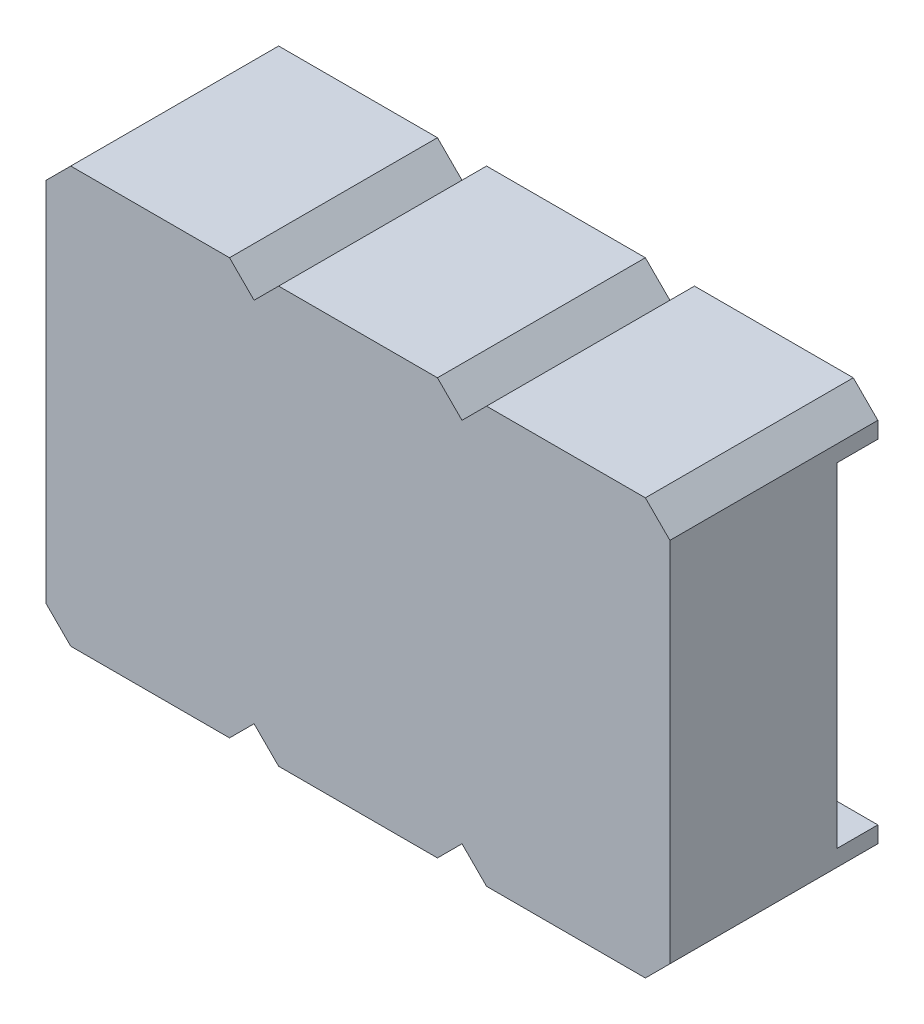
ISO-10303-21;
HEADER;
FILE_DESCRIPTION(('STEP AP214'),'2;1');
FILE_NAME('part.step','',(''),(''),'','','');
FILE_SCHEMA(('AUTOMOTIVE_DESIGN { 1 0 10303 214 1 1 1 1 }'));
ENDSEC;
DATA;
#1=APPLICATION_CONTEXT('core data for automotive mechanical design processes');
#2=APPLICATION_PROTOCOL_DEFINITION('international standard','automotive_design',2000,#1);
#3=PRODUCT_CONTEXT('',#1,'mechanical');
#4=PRODUCT('Part','Part','',(#3));
#5=PRODUCT_RELATED_PRODUCT_CATEGORY('part','',(#4));
#6=PRODUCT_DEFINITION_FORMATION('','',#4);
#7=PRODUCT_DEFINITION_CONTEXT('part definition',#1,'design');
#8=PRODUCT_DEFINITION('design','',#6,#7);
#9=PRODUCT_DEFINITION_SHAPE('','',#8);
#10=(LENGTH_UNIT() NAMED_UNIT(*) SI_UNIT(.MILLI.,.METRE.));
#11=(NAMED_UNIT(*) PLANE_ANGLE_UNIT() SI_UNIT($,.RADIAN.));
#12=(NAMED_UNIT(*) SI_UNIT($,.STERADIAN.) SOLID_ANGLE_UNIT());
#13=UNCERTAINTY_MEASURE_WITH_UNIT(LENGTH_MEASURE(1.E-05),#10,'distance_accuracy_value','');
#14=(GEOMETRIC_REPRESENTATION_CONTEXT(3) GLOBAL_UNCERTAINTY_ASSIGNED_CONTEXT((#13)) GLOBAL_UNIT_ASSIGNED_CONTEXT((#10,
#11,#12)) REPRESENTATION_CONTEXT('',''));
#15=CARTESIAN_POINT('',(0.,0.,0.));
#16=DIRECTION('',(0.,0.,1.));
#17=DIRECTION('',(1.,0.,0.));
#18=AXIS2_PLACEMENT_3D('',#15,#16,#17);
#19=CARTESIAN_POINT('',(0.,-2.04,0.));
#20=DIRECTION('',(0.,1.,0.));
#21=DIRECTION('',(0.,0.,1.));
#22=AXIS2_PLACEMENT_3D('',#19,#20,#21);
#23=PLANE('',#22);
#24=DIRECTION('',(-1.,0.,0.));
#25=VECTOR('',#24,1.);
#26=CARTESIAN_POINT('',(0.,-2.04,0.));
#27=LINE('',#26,#25);
#28=CARTESIAN_POINT('',(-3.81,-2.04,0.));
#29=VERTEX_POINT('',#28);
#30=CARTESIAN_POINT('',(3.81,-2.04,0.));
#31=VERTEX_POINT('',#30);
#32=EDGE_CURVE('E219',#29,#31,#27,.F.);
#33=ORIENTED_EDGE('',*,*,#32,.F.);
#34=DIRECTION('',(0.,0.,1.));
#35=VECTOR('',#34,1.);
#36=CARTESIAN_POINT('',(-3.81,-2.04,0.));
#37=LINE('',#36,#35);
#38=CARTESIAN_POINT('',(-3.81,-2.04,0.5));
#39=VERTEX_POINT('',#38);
#40=EDGE_CURVE('E212',#29,#39,#37,.T.);
#41=ORIENTED_EDGE('',*,*,#40,.T.);
#42=DIRECTION('',(-1.,0.,0.));
#43=VECTOR('',#42,1.);
#44=CARTESIAN_POINT('',(0.,-2.04,0.5));
#45=LINE('',#44,#43);
#46=CARTESIAN_POINT('',(3.81,-2.04,0.5));
#47=VERTEX_POINT('',#46);
#48=EDGE_CURVE('E221',#47,#39,#45,.T.);
#49=ORIENTED_EDGE('',*,*,#48,.F.);
#50=DIRECTION('',(0.,0.,1.));
#51=VECTOR('',#50,1.);
#52=CARTESIAN_POINT('',(3.81,-2.04,0.));
#53=LINE('',#52,#51);
#54=EDGE_CURVE('E20',#47,#31,#53,.F.);
#55=ORIENTED_EDGE('',*,*,#54,.T.);
#56=EDGE_LOOP('',(#33,#41,#49,#55));
#57=FACE_BOUND('',#56,.T.);
#58=ADVANCED_FACE('F17',(#57),#23,.T.);
#59=CARTESIAN_POINT('',(0.,2.04,2.54));
#60=DIRECTION('',(0.,-1.,0.));
#61=DIRECTION('',(0.,0.,-1.));
#62=AXIS2_PLACEMENT_3D('',#59,#60,#61);
#63=PLANE('',#62);
#64=DIRECTION('',(-1.,0.,0.));
#65=VECTOR('',#64,1.);
#66=CARTESIAN_POINT('',(0.,2.04,0.));
#67=LINE('',#66,#65);
#68=CARTESIAN_POINT('',(3.81,2.04,0.));
#69=VERTEX_POINT('',#68);
#70=CARTESIAN_POINT('',(-3.81,2.04,0.));
#71=VERTEX_POINT('',#70);
#72=EDGE_CURVE('E368',#69,#71,#67,.T.);
#73=ORIENTED_EDGE('',*,*,#72,.F.);
#74=DIRECTION('',(0.,0.,-1.));
#75=VECTOR('',#74,1.);
#76=CARTESIAN_POINT('',(3.81,2.04,2.54));
#77=LINE('',#76,#75);
#78=CARTESIAN_POINT('',(3.81,2.04,0.5));
#79=VERTEX_POINT('',#78);
#80=EDGE_CURVE('E209',#69,#79,#77,.F.);
#81=ORIENTED_EDGE('',*,*,#80,.T.);
#82=DIRECTION('',(-1.,0.,0.));
#83=VECTOR('',#82,1.);
#84=CARTESIAN_POINT('',(0.,2.04,0.5));
#85=LINE('',#84,#83);
#86=CARTESIAN_POINT('',(-3.81,2.04,0.5));
#87=VERTEX_POINT('',#86);
#88=EDGE_CURVE('E378',#87,#79,#85,.F.);
#89=ORIENTED_EDGE('',*,*,#88,.F.);
#90=DIRECTION('',(0.,0.,-1.));
#91=VECTOR('',#90,1.);
#92=CARTESIAN_POINT('',(-3.81,2.04,2.54));
#93=LINE('',#92,#91);
#94=EDGE_CURVE('E211',#87,#71,#93,.T.);
#95=ORIENTED_EDGE('',*,*,#94,.T.);
#96=EDGE_LOOP('',(#73,#81,#89,#95));
#97=FACE_BOUND('',#96,.T.);
#98=ADVANCED_FACE('F639',(#97),#63,.T.);
#99=CARTESIAN_POINT('',(1.12,2.39,0.76));
#100=DIRECTION('',(0.707106781186548,0.707106781186548,0.));
#101=DIRECTION('',(-0.707106781186548,0.707106781186548,0.));
#102=AXIS2_PLACEMENT_3D('',#99,#100,#101);
#103=PLANE('',#102);
#104=DIRECTION('',(0.707106781186548,-0.707106781186547,0.));
#105=VECTOR('',#104,1.);
#106=CARTESIAN_POINT('',(0.97,2.54,0.));
#107=LINE('',#106,#105);
#108=CARTESIAN_POINT('',(0.97,2.54,0.));
#109=VERTEX_POINT('',#108);
#110=CARTESIAN_POINT('',(1.27,2.24,0.));
#111=VERTEX_POINT('',#110);
#112=EDGE_CURVE('E374',#109,#111,#107,.T.);
#113=ORIENTED_EDGE('',*,*,#112,.F.);
#114=DIRECTION('',(0.,0.,1.));
#115=VECTOR('',#114,1.);
#116=CARTESIAN_POINT('',(0.97,2.54,0.));
#117=LINE('',#116,#115);
#118=CARTESIAN_POINT('',(0.97,2.54,2.54));
#119=VERTEX_POINT('',#118);
#120=EDGE_CURVE('E354',#119,#109,#117,.F.);
#121=ORIENTED_EDGE('',*,*,#120,.F.);
#122=DIRECTION('',(-0.707106781186548,0.707106781186548,0.));
#123=VECTOR('',#122,1.);
#124=CARTESIAN_POINT('',(1.12,2.39,2.54));
#125=LINE('',#124,#123);
#126=CARTESIAN_POINT('',(1.27,2.24,2.54));
#127=VERTEX_POINT('',#126);
#128=EDGE_CURVE('E191',#119,#127,#125,.F.);
#129=ORIENTED_EDGE('',*,*,#128,.T.);
#130=DIRECTION('',(0.,0.,1.));
#131=VECTOR('',#130,1.);
#132=CARTESIAN_POINT('',(1.27,2.24,0.76));
#133=LINE('',#132,#131);
#134=EDGE_CURVE('E358',#111,#127,#133,.T.);
#135=ORIENTED_EDGE('',*,*,#134,.F.);
#136=EDGE_LOOP('',(#113,#121,#129,#135));
#137=FACE_BOUND('',#136,.T.);
#138=ADVANCED_FACE('F420',(#137),#103,.T.);
#139=CARTESIAN_POINT('',(-1.12,2.39,0.76));
#140=DIRECTION('',(-0.707106781186548,0.707106781186548,0.));
#141=DIRECTION('',(-0.707106781186548,-0.707106781186548,0.));
#142=AXIS2_PLACEMENT_3D('',#139,#140,#141);
#143=PLANE('',#142);
#144=DIRECTION('',(-0.707106781186548,-0.707106781186548,0.));
#145=VECTOR('',#144,1.);
#146=CARTESIAN_POINT('',(-1.12,2.39,2.54));
#147=LINE('',#146,#145);
#148=CARTESIAN_POINT('',(-1.27,2.24,2.54));
#149=VERTEX_POINT('',#148);
#150=CARTESIAN_POINT('',(-0.97,2.54,2.54));
#151=VERTEX_POINT('',#150);
#152=EDGE_CURVE('E179',#149,#151,#147,.F.);
#153=ORIENTED_EDGE('',*,*,#152,.T.);
#154=DIRECTION('',(0.,0.,1.));
#155=VECTOR('',#154,1.);
#156=CARTESIAN_POINT('',(-0.97,2.54,0.));
#157=LINE('',#156,#155);
#158=CARTESIAN_POINT('',(-0.97,2.54,0.));
#159=VERTEX_POINT('',#158);
#160=EDGE_CURVE('E349',#159,#151,#157,.T.);
#161=ORIENTED_EDGE('',*,*,#160,.F.);
#162=DIRECTION('',(0.707106781186548,0.707106781186547,0.));
#163=VECTOR('',#162,1.);
#164=CARTESIAN_POINT('',(-1.27,2.24,0.));
#165=LINE('',#164,#163);
#166=CARTESIAN_POINT('',(-1.27,2.24,0.));
#167=VERTEX_POINT('',#166);
#168=EDGE_CURVE('E196',#167,#159,#165,.T.);
#169=ORIENTED_EDGE('',*,*,#168,.F.);
#170=DIRECTION('',(0.,0.,1.));
#171=VECTOR('',#170,1.);
#172=CARTESIAN_POINT('',(-1.27,2.24,0.76));
#173=LINE('',#172,#171);
#174=EDGE_CURVE('E194',#149,#167,#173,.F.);
#175=ORIENTED_EDGE('',*,*,#174,.F.);
#176=EDGE_LOOP('',(#153,#161,#169,#175));
#177=FACE_BOUND('',#176,.T.);
#178=ADVANCED_FACE('F195',(#177),#143,.T.);
#179=CARTESIAN_POINT('',(-1.42,2.39,0.76));
#180=DIRECTION('',(0.707106781186548,0.707106781186548,0.));
#181=DIRECTION('',(-0.707106781186548,0.707106781186548,0.));
#182=AXIS2_PLACEMENT_3D('',#179,#180,#181);
#183=PLANE('',#182);
#184=DIRECTION('',(0.707106781186547,-0.707106781186547,0.));
#185=VECTOR('',#184,1.);
#186=CARTESIAN_POINT('',(-1.57,2.54,0.));
#187=LINE('',#186,#185);
#188=CARTESIAN_POINT('',(-1.57,2.54,0.));
#189=VERTEX_POINT('',#188);
#190=EDGE_CURVE('E364',#189,#167,#187,.T.);
#191=ORIENTED_EDGE('',*,*,#190,.F.);
#192=DIRECTION('',(0.,0.,1.));
#193=VECTOR('',#192,1.);
#194=CARTESIAN_POINT('',(-1.57,2.54,0.));
#195=LINE('',#194,#193);
#196=CARTESIAN_POINT('',(-1.57,2.54,2.54));
#197=VERTEX_POINT('',#196);
#198=EDGE_CURVE('E203',#197,#189,#195,.F.);
#199=ORIENTED_EDGE('',*,*,#198,.F.);
#200=DIRECTION('',(-0.707106781186548,0.707106781186548,0.));
#201=VECTOR('',#200,1.);
#202=CARTESIAN_POINT('',(-1.42,2.39,2.54));
#203=LINE('',#202,#201);
#204=EDGE_CURVE('E184',#197,#149,#203,.F.);
#205=ORIENTED_EDGE('',*,*,#204,.T.);
#206=ORIENTED_EDGE('',*,*,#174,.T.);
#207=EDGE_LOOP('',(#191,#199,#205,#206));
#208=FACE_BOUND('',#207,.T.);
#209=ADVANCED_FACE('F201',(#208),#183,.T.);
#210=CARTESIAN_POINT('',(-3.66,2.39,0.76));
#211=DIRECTION('',(-0.707106781186548,0.707106781186548,0.));
#212=DIRECTION('',(-0.707106781186548,-0.707106781186548,0.));
#213=AXIS2_PLACEMENT_3D('',#210,#211,#212);
#214=PLANE('',#213);
#215=DIRECTION('',(-0.707106781186548,-0.707106781186548,0.));
#216=VECTOR('',#215,1.);
#217=CARTESIAN_POINT('',(-3.66,2.39,2.54));
#218=LINE('',#217,#216);
#219=CARTESIAN_POINT('',(-3.81,2.24,2.54));
#220=VERTEX_POINT('',#219);
#221=CARTESIAN_POINT('',(-3.51,2.54,2.54));
#222=VERTEX_POINT('',#221);
#223=EDGE_CURVE('E199',#220,#222,#218,.F.);
#224=ORIENTED_EDGE('',*,*,#223,.T.);
#225=DIRECTION('',(0.,0.,1.));
#226=VECTOR('',#225,1.);
#227=CARTESIAN_POINT('',(-3.51,2.54,0.));
#228=LINE('',#227,#226);
#229=CARTESIAN_POINT('',(-3.51,2.54,0.));
#230=VERTEX_POINT('',#229);
#231=EDGE_CURVE('E273',#230,#222,#228,.T.);
#232=ORIENTED_EDGE('',*,*,#231,.F.);
#233=DIRECTION('',(0.707106781186548,0.707106781186547,0.));
#234=VECTOR('',#233,1.);
#235=CARTESIAN_POINT('',(-3.81,2.24,0.));
#236=LINE('',#235,#234);
#237=CARTESIAN_POINT('',(-3.81,2.24,0.));
#238=VERTEX_POINT('',#237);
#239=EDGE_CURVE('E366',#238,#230,#236,.T.);
#240=ORIENTED_EDGE('',*,*,#239,.F.);
#241=DIRECTION('',(0.,0.,1.));
#242=VECTOR('',#241,1.);
#243=CARTESIAN_POINT('',(-3.81,2.24,1.52));
#244=LINE('',#243,#242);
#245=EDGE_CURVE('E276',#220,#238,#244,.F.);
#246=ORIENTED_EDGE('',*,*,#245,.F.);
#247=EDGE_LOOP('',(#224,#232,#240,#246));
#248=FACE_BOUND('',#247,.T.);
#249=ADVANCED_FACE('F272',(#248),#214,.T.);
#250=CARTESIAN_POINT('',(-1.42,-2.39,2.03));
#251=DIRECTION('',(0.707106781186548,-0.707106781186548,0.));
#252=DIRECTION('',(0.707106781186548,0.707106781186548,0.));
#253=AXIS2_PLACEMENT_3D('',#250,#251,#252);
#254=PLANE('',#253);
#255=DIRECTION('',(0.707106781186548,0.707106781186548,0.));
#256=VECTOR('',#255,1.);
#257=CARTESIAN_POINT('',(-1.42,-2.39,2.54));
#258=LINE('',#257,#256);
#259=CARTESIAN_POINT('',(-1.27,-2.24,2.54));
#260=VERTEX_POINT('',#259);
#261=CARTESIAN_POINT('',(-1.57,-2.54,2.54));
#262=VERTEX_POINT('',#261);
#263=EDGE_CURVE('E175',#260,#262,#258,.F.);
#264=ORIENTED_EDGE('',*,*,#263,.T.);
#265=DIRECTION('',(0.,0.,-1.));
#266=VECTOR('',#265,1.);
#267=CARTESIAN_POINT('',(-1.57,-2.54,2.54));
#268=LINE('',#267,#266);
#269=CARTESIAN_POINT('',(-1.57,-2.54,0.));
#270=VERTEX_POINT('',#269);
#271=EDGE_CURVE('E333',#270,#262,#268,.F.);
#272=ORIENTED_EDGE('',*,*,#271,.F.);
#273=DIRECTION('',(-0.707106781186547,-0.707106781186547,0.));
#274=VECTOR('',#273,1.);
#275=CARTESIAN_POINT('',(-1.27,-2.24,0.));
#276=LINE('',#275,#274);
#277=CARTESIAN_POINT('',(-1.27,-2.24,0.));
#278=VERTEX_POINT('',#277);
#279=EDGE_CURVE('E241',#278,#270,#276,.T.);
#280=ORIENTED_EDGE('',*,*,#279,.F.);
#281=DIRECTION('',(0.,0.,1.));
#282=VECTOR('',#281,1.);
#283=CARTESIAN_POINT('',(-1.27,-2.24,2.03));
#284=LINE('',#283,#282);
#285=EDGE_CURVE('E259',#260,#278,#284,.F.);
#286=ORIENTED_EDGE('',*,*,#285,.F.);
#287=EDGE_LOOP('',(#264,#272,#280,#286));
#288=FACE_BOUND('',#287,.T.);
#289=ADVANCED_FACE('F438',(#288),#254,.T.);
#290=CARTESIAN_POINT('',(-3.66,-2.39,2.03));
#291=DIRECTION('',(-0.707106781186548,-0.707106781186548,0.));
#292=DIRECTION('',(0.707106781186548,-0.707106781186548,0.));
#293=AXIS2_PLACEMENT_3D('',#290,#291,#292);
#294=PLANE('',#293);
#295=DIRECTION('',(-0.707106781186548,0.707106781186547,0.));
#296=VECTOR('',#295,1.);
#297=CARTESIAN_POINT('',(-3.51,-2.54,0.));
#298=LINE('',#297,#296);
#299=CARTESIAN_POINT('',(-3.51,-2.54,0.));
#300=VERTEX_POINT('',#299);
#301=CARTESIAN_POINT('',(-3.81,-2.24,0.));
#302=VERTEX_POINT('',#301);
#303=EDGE_CURVE('E239',#300,#302,#298,.T.);
#304=ORIENTED_EDGE('',*,*,#303,.F.);
#305=DIRECTION('',(0.,0.,-1.));
#306=VECTOR('',#305,1.);
#307=CARTESIAN_POINT('',(-3.51,-2.54,2.54));
#308=LINE('',#307,#306);
#309=CARTESIAN_POINT('',(-3.51,-2.54,2.54));
#310=VERTEX_POINT('',#309);
#311=EDGE_CURVE('E330',#310,#300,#308,.T.);
#312=ORIENTED_EDGE('',*,*,#311,.F.);
#313=DIRECTION('',(0.707106781186548,-0.707106781186548,0.));
#314=VECTOR('',#313,1.);
#315=CARTESIAN_POINT('',(-3.66,-2.39,2.54));
#316=LINE('',#315,#314);
#317=CARTESIAN_POINT('',(-3.81,-2.24,2.54));
#318=VERTEX_POINT('',#317);
#319=EDGE_CURVE('E266',#310,#318,#316,.F.);
#320=ORIENTED_EDGE('',*,*,#319,.T.);
#321=DIRECTION('',(0.,0.,1.));
#322=VECTOR('',#321,1.);
#323=CARTESIAN_POINT('',(-3.81,-2.24,1.52));
#324=LINE('',#323,#322);
#325=EDGE_CURVE('E336',#302,#318,#324,.T.);
#326=ORIENTED_EDGE('',*,*,#325,.F.);
#327=EDGE_LOOP('',(#304,#312,#320,#326));
#328=FACE_BOUND('',#327,.T.);
#329=ADVANCED_FACE('F432',(#328),#294,.T.);
#330=CARTESIAN_POINT('',(1.12,-2.39,2.03));
#331=DIRECTION('',(0.707106781186548,-0.707106781186548,0.));
#332=DIRECTION('',(0.707106781186548,0.707106781186548,0.));
#333=AXIS2_PLACEMENT_3D('',#330,#331,#332);
#334=PLANE('',#333);
#335=DIRECTION('',(0.707106781186548,0.707106781186548,0.));
#336=VECTOR('',#335,1.);
#337=CARTESIAN_POINT('',(1.12,-2.39,2.54));
#338=LINE('',#337,#336);
#339=CARTESIAN_POINT('',(1.27,-2.24,2.54));
#340=VERTEX_POINT('',#339);
#341=CARTESIAN_POINT('',(0.97,-2.54,2.54));
#342=VERTEX_POINT('',#341);
#343=EDGE_CURVE('E264',#340,#342,#338,.F.);
#344=ORIENTED_EDGE('',*,*,#343,.T.);
#345=DIRECTION('',(0.,0.,-1.));
#346=VECTOR('',#345,1.);
#347=CARTESIAN_POINT('',(0.97,-2.54,2.54));
#348=LINE('',#347,#346);
#349=CARTESIAN_POINT('',(0.97,-2.54,0.));
#350=VERTEX_POINT('',#349);
#351=EDGE_CURVE('E324',#350,#342,#348,.F.);
#352=ORIENTED_EDGE('',*,*,#351,.F.);
#353=DIRECTION('',(-0.707106781186548,-0.707106781186547,0.));
#354=VECTOR('',#353,1.);
#355=CARTESIAN_POINT('',(1.27,-2.24,0.));
#356=LINE('',#355,#354);
#357=CARTESIAN_POINT('',(1.27,-2.24,0.));
#358=VERTEX_POINT('',#357);
#359=EDGE_CURVE('E250',#358,#350,#356,.T.);
#360=ORIENTED_EDGE('',*,*,#359,.F.);
#361=DIRECTION('',(0.,0.,1.));
#362=VECTOR('',#361,1.);
#363=CARTESIAN_POINT('',(1.27,-2.24,2.03));
#364=LINE('',#363,#362);
#365=EDGE_CURVE('E253',#340,#358,#364,.F.);
#366=ORIENTED_EDGE('',*,*,#365,.F.);
#367=EDGE_LOOP('',(#344,#352,#360,#366));
#368=FACE_BOUND('',#367,.T.);
#369=ADVANCED_FACE('F393',(#368),#334,.T.);
#370=CARTESIAN_POINT('',(-1.12,-2.39,2.03));
#371=DIRECTION('',(-0.707106781186548,-0.707106781186548,0.));
#372=DIRECTION('',(0.707106781186548,-0.707106781186548,0.));
#373=AXIS2_PLACEMENT_3D('',#370,#371,#372);
#374=PLANE('',#373);
#375=DIRECTION('',(-0.707106781186548,0.707106781186547,0.));
#376=VECTOR('',#375,1.);
#377=CARTESIAN_POINT('',(-0.97,-2.54,0.));
#378=LINE('',#377,#376);
#379=CARTESIAN_POINT('',(-0.97,-2.54,0.));
#380=VERTEX_POINT('',#379);
#381=EDGE_CURVE('E247',#380,#278,#378,.T.);
#382=ORIENTED_EDGE('',*,*,#381,.F.);
#383=DIRECTION('',(0.,0.,-1.));
#384=VECTOR('',#383,1.);
#385=CARTESIAN_POINT('',(-0.97,-2.54,2.54));
#386=LINE('',#385,#384);
#387=CARTESIAN_POINT('',(-0.97,-2.54,2.54));
#388=VERTEX_POINT('',#387);
#389=EDGE_CURVE('E321',#388,#380,#386,.T.);
#390=ORIENTED_EDGE('',*,*,#389,.F.);
#391=DIRECTION('',(0.707106781186548,-0.707106781186548,0.));
#392=VECTOR('',#391,1.);
#393=CARTESIAN_POINT('',(-1.12,-2.39,2.54));
#394=LINE('',#393,#392);
#395=EDGE_CURVE('E261',#388,#260,#394,.F.);
#396=ORIENTED_EDGE('',*,*,#395,.T.);
#397=ORIENTED_EDGE('',*,*,#285,.T.);
#398=EDGE_LOOP('',(#382,#390,#396,#397));
#399=FACE_BOUND('',#398,.T.);
#400=ADVANCED_FACE('F440',(#399),#374,.T.);
#401=CARTESIAN_POINT('',(1.42,-2.39,2.03));
#402=DIRECTION('',(-0.707106781186548,-0.707106781186548,0.));
#403=DIRECTION('',(0.707106781186548,-0.707106781186548,0.));
#404=AXIS2_PLACEMENT_3D('',#401,#402,#403);
#405=PLANE('',#404);
#406=DIRECTION('',(-0.707106781186547,0.707106781186547,0.));
#407=VECTOR('',#406,1.);
#408=CARTESIAN_POINT('',(1.57,-2.54,0.));
#409=LINE('',#408,#407);
#410=CARTESIAN_POINT('',(1.57,-2.54,0.));
#411=VERTEX_POINT('',#410);
#412=EDGE_CURVE('E233',#411,#358,#409,.T.);
#413=ORIENTED_EDGE('',*,*,#412,.F.);
#414=DIRECTION('',(0.,0.,-1.));
#415=VECTOR('',#414,1.);
#416=CARTESIAN_POINT('',(1.57,-2.54,2.54));
#417=LINE('',#416,#415);
#418=CARTESIAN_POINT('',(1.57,-2.54,2.54));
#419=VERTEX_POINT('',#418);
#420=EDGE_CURVE('E312',#419,#411,#417,.T.);
#421=ORIENTED_EDGE('',*,*,#420,.F.);
#422=DIRECTION('',(0.707106781186548,-0.707106781186548,0.));
#423=VECTOR('',#422,1.);
#424=CARTESIAN_POINT('',(1.42,-2.39,2.54));
#425=LINE('',#424,#423);
#426=EDGE_CURVE('E256',#419,#340,#425,.F.);
#427=ORIENTED_EDGE('',*,*,#426,.T.);
#428=ORIENTED_EDGE('',*,*,#365,.T.);
#429=EDGE_LOOP('',(#413,#421,#427,#428));
#430=FACE_BOUND('',#429,.T.);
#431=ADVANCED_FACE('F389',(#430),#405,.T.);
#432=CARTESIAN_POINT('',(0.,-2.54,0.));
#433=DIRECTION('',(0.,0.,-1.));
#434=DIRECTION('',(-1.,0.,0.));
#435=AXIS2_PLACEMENT_3D('',#432,#433,#434);
#436=PLANE('',#435);
#437=DIRECTION('',(1.,0.,0.));
#438=VECTOR('',#437,1.);
#439=CARTESIAN_POINT('',(2.54,-2.54,0.));
#440=LINE('',#439,#438);
#441=CARTESIAN_POINT('',(3.51,-2.54,0.));
#442=VERTEX_POINT('',#441);
#443=EDGE_CURVE('E309',#411,#442,#440,.T.);
#444=ORIENTED_EDGE('',*,*,#443,.F.);
#445=ORIENTED_EDGE('',*,*,#412,.T.);
#446=ORIENTED_EDGE('',*,*,#359,.T.);
#447=DIRECTION('',(1.,0.,0.));
#448=VECTOR('',#447,1.);
#449=CARTESIAN_POINT('',(0.,-2.54,0.));
#450=LINE('',#449,#448);
#451=EDGE_CURVE('E318',#380,#350,#450,.T.);
#452=ORIENTED_EDGE('',*,*,#451,.F.);
#453=ORIENTED_EDGE('',*,*,#381,.T.);
#454=ORIENTED_EDGE('',*,*,#279,.T.);
#455=DIRECTION('',(1.,0.,0.));
#456=VECTOR('',#455,1.);
#457=CARTESIAN_POINT('',(-2.54,-2.54,0.));
#458=LINE('',#457,#456);
#459=EDGE_CURVE('E327',#300,#270,#458,.T.);
#460=ORIENTED_EDGE('',*,*,#459,.F.);
#461=ORIENTED_EDGE('',*,*,#303,.T.);
#462=DIRECTION('',(0.,1.,0.));
#463=VECTOR('',#462,1.);
#464=CARTESIAN_POINT('',(-3.81,0.,0.));
#465=LINE('',#464,#463);
#466=EDGE_CURVE('E238',#29,#302,#465,.F.);
#467=ORIENTED_EDGE('',*,*,#466,.F.);
#468=ORIENTED_EDGE('',*,*,#32,.T.);
#469=DIRECTION('',(0.,1.,0.));
#470=VECTOR('',#469,1.);
#471=CARTESIAN_POINT('',(3.81,-2.54,0.));
#472=LINE('',#471,#470);
#473=CARTESIAN_POINT('',(3.81,-2.24,0.));
#474=VERTEX_POINT('',#473);
#475=EDGE_CURVE('E226',#31,#474,#472,.F.);
#476=ORIENTED_EDGE('',*,*,#475,.T.);
#477=DIRECTION('',(0.707106781186548,0.707106781186548,0.));
#478=VECTOR('',#477,1.);
#479=CARTESIAN_POINT('',(3.66,-2.39,0.));
#480=LINE('',#479,#478);
#481=EDGE_CURVE('E384',#442,#474,#480,.T.);
#482=ORIENTED_EDGE('',*,*,#481,.F.);
#483=EDGE_LOOP('',(#444,#445,#446,#452,#453,#454,#460,#461,#467,#468,#476,#482));
#484=FACE_BOUND('',#483,.T.);
#485=ADVANCED_FACE('F236',(#484),#436,.T.);
#486=CARTESIAN_POINT('',(3.66,-2.39,2.03));
#487=DIRECTION('',(0.707106781186548,-0.707106781186548,0.));
#488=DIRECTION('',(0.707106781186548,0.707106781186548,0.));
#489=AXIS2_PLACEMENT_3D('',#486,#487,#488);
#490=PLANE('',#489);
#491=DIRECTION('',(0.707106781186548,0.707106781186548,0.));
#492=VECTOR('',#491,1.);
#493=CARTESIAN_POINT('',(3.66,-2.39,2.54));
#494=LINE('',#493,#492);
#495=CARTESIAN_POINT('',(3.81,-2.24,2.54));
#496=VERTEX_POINT('',#495);
#497=CARTESIAN_POINT('',(3.51,-2.54,2.54));
#498=VERTEX_POINT('',#497);
#499=EDGE_CURVE('E382',#496,#498,#494,.F.);
#500=ORIENTED_EDGE('',*,*,#499,.T.);
#501=DIRECTION('',(0.,0.,-1.));
#502=VECTOR('',#501,1.);
#503=CARTESIAN_POINT('',(3.51,-2.54,2.54));
#504=LINE('',#503,#502);
#505=EDGE_CURVE('E315',#442,#498,#504,.F.);
#506=ORIENTED_EDGE('',*,*,#505,.F.);
#507=ORIENTED_EDGE('',*,*,#481,.T.);
#508=DIRECTION('',(0.,0.,-1.));
#509=VECTOR('',#508,1.);
#510=CARTESIAN_POINT('',(3.81,-2.24,1.52));
#511=LINE('',#510,#509);
#512=EDGE_CURVE('E230',#496,#474,#511,.T.);
#513=ORIENTED_EDGE('',*,*,#512,.F.);
#514=EDGE_LOOP('',(#500,#506,#507,#513));
#515=FACE_BOUND('',#514,.T.);
#516=ADVANCED_FACE('F482',(#515),#490,.T.);
#517=CARTESIAN_POINT('',(0.,-2.54,0.5));
#518=DIRECTION('',(0.,0.,-1.));
#519=DIRECTION('',(-1.,0.,0.));
#520=AXIS2_PLACEMENT_3D('',#517,#518,#519);
#521=PLANE('',#520);
#522=ORIENTED_EDGE('',*,*,#88,.T.);
#523=DIRECTION('',(0.,1.,0.));
#524=VECTOR('',#523,1.);
#525=CARTESIAN_POINT('',(3.81,0.,0.5));
#526=LINE('',#525,#524);
#527=EDGE_CURVE('E303',#47,#79,#526,.T.);
#528=ORIENTED_EDGE('',*,*,#527,.F.);
#529=ORIENTED_EDGE('',*,*,#48,.T.);
#530=DIRECTION('',(0.,1.,0.));
#531=VECTOR('',#530,1.);
#532=CARTESIAN_POINT('',(-3.81,0.,0.5));
#533=LINE('',#532,#531);
#534=EDGE_CURVE('E340',#87,#39,#533,.F.);
#535=ORIENTED_EDGE('',*,*,#534,.F.);
#536=EDGE_LOOP('',(#522,#528,#529,#535));
#537=FACE_BOUND('',#536,.T.);
#538=ADVANCED_FACE('F479',(#537),#521,.T.);
#539=CARTESIAN_POINT('',(3.66,2.39,0.76));
#540=DIRECTION('',(0.707106781186548,0.707106781186548,0.));
#541=DIRECTION('',(-0.707106781186548,0.707106781186548,0.));
#542=AXIS2_PLACEMENT_3D('',#539,#540,#541);
#543=PLANE('',#542);
#544=DIRECTION('',(0.707106781186548,-0.707106781186547,0.));
#545=VECTOR('',#544,1.);
#546=CARTESIAN_POINT('',(3.51,2.54,0.));
#547=LINE('',#546,#545);
#548=CARTESIAN_POINT('',(3.51,2.54,0.));
#549=VERTEX_POINT('',#548);
#550=CARTESIAN_POINT('',(3.81,2.24,0.));
#551=VERTEX_POINT('',#550);
#552=EDGE_CURVE('E371',#549,#551,#547,.T.);
#553=ORIENTED_EDGE('',*,*,#552,.F.);
#554=DIRECTION('',(0.,0.,1.));
#555=VECTOR('',#554,1.);
#556=CARTESIAN_POINT('',(3.51,2.54,0.));
#557=LINE('',#556,#555);
#558=CARTESIAN_POINT('',(3.51,2.54,2.54));
#559=VERTEX_POINT('',#558);
#560=EDGE_CURVE('E297',#559,#549,#557,.F.);
#561=ORIENTED_EDGE('',*,*,#560,.F.);
#562=DIRECTION('',(-0.707106781186548,0.707106781186548,0.));
#563=VECTOR('',#562,1.);
#564=CARTESIAN_POINT('',(3.66,2.39,2.54));
#565=LINE('',#564,#563);
#566=CARTESIAN_POINT('',(3.81,2.24,2.54));
#567=VERTEX_POINT('',#566);
#568=EDGE_CURVE('E376',#559,#567,#565,.F.);
#569=ORIENTED_EDGE('',*,*,#568,.T.);
#570=DIRECTION('',(0.,0.,-1.));
#571=VECTOR('',#570,1.);
#572=CARTESIAN_POINT('',(3.81,2.24,1.52));
#573=LINE('',#572,#571);
#574=EDGE_CURVE('E306',#551,#567,#573,.F.);
#575=ORIENTED_EDGE('',*,*,#574,.F.);
#576=EDGE_LOOP('',(#553,#561,#569,#575));
#577=FACE_BOUND('',#576,.T.);
#578=ADVANCED_FACE('F409',(#577),#543,.T.);
#579=CARTESIAN_POINT('',(0.,2.04,0.));
#580=DIRECTION('',(0.,0.,-1.));
#581=DIRECTION('',(-1.,0.,0.));
#582=AXIS2_PLACEMENT_3D('',#579,#580,#581);
#583=PLANE('',#582);
#584=ORIENTED_EDGE('',*,*,#168,.T.);
#585=DIRECTION('',(1.,0.,0.));
#586=VECTOR('',#585,1.);
#587=CARTESIAN_POINT('',(0.,2.54,0.));
#588=LINE('',#587,#586);
#589=EDGE_CURVE('E351',#109,#159,#588,.F.);
#590=ORIENTED_EDGE('',*,*,#589,.F.);
#591=ORIENTED_EDGE('',*,*,#112,.T.);
#592=DIRECTION('',(-0.707106781186548,-0.707106781186548,0.));
#593=VECTOR('',#592,1.);
#594=CARTESIAN_POINT('',(1.42,2.39,0.));
#595=LINE('',#594,#593);
#596=CARTESIAN_POINT('',(1.57,2.54,0.));
#597=VERTEX_POINT('',#596);
#598=EDGE_CURVE('E360',#597,#111,#595,.T.);
#599=ORIENTED_EDGE('',*,*,#598,.F.);
#600=DIRECTION('',(1.,0.,0.));
#601=VECTOR('',#600,1.);
#602=CARTESIAN_POINT('',(2.54,2.54,0.));
#603=LINE('',#602,#601);
#604=EDGE_CURVE('E294',#549,#597,#603,.F.);
#605=ORIENTED_EDGE('',*,*,#604,.F.);
#606=ORIENTED_EDGE('',*,*,#552,.T.);
#607=DIRECTION('',(0.,1.,0.));
#608=VECTOR('',#607,1.);
#609=CARTESIAN_POINT('',(3.81,0.,0.));
#610=LINE('',#609,#608);
#611=EDGE_CURVE('E300',#69,#551,#610,.T.);
#612=ORIENTED_EDGE('',*,*,#611,.F.);
#613=ORIENTED_EDGE('',*,*,#72,.T.);
#614=DIRECTION('',(0.,1.,0.));
#615=VECTOR('',#614,1.);
#616=CARTESIAN_POINT('',(-3.81,0.,0.));
#617=LINE('',#616,#615);
#618=EDGE_CURVE('E343',#238,#71,#617,.F.);
#619=ORIENTED_EDGE('',*,*,#618,.F.);
#620=ORIENTED_EDGE('',*,*,#239,.T.);
#621=DIRECTION('',(1.,0.,0.));
#622=VECTOR('',#621,1.);
#623=CARTESIAN_POINT('',(-2.54,2.54,0.));
#624=LINE('',#623,#622);
#625=EDGE_CURVE('E283',#189,#230,#624,.F.);
#626=ORIENTED_EDGE('',*,*,#625,.F.);
#627=ORIENTED_EDGE('',*,*,#190,.T.);
#628=EDGE_LOOP('',(#584,#590,#591,#599,#605,#606,#612,#613,#619,#620,#626,#627));
#629=FACE_BOUND('',#628,.T.);
#630=ADVANCED_FACE('F412',(#629),#583,.T.);
#631=CARTESIAN_POINT('',(1.42,2.39,0.76));
#632=DIRECTION('',(-0.707106781186548,0.707106781186548,0.));
#633=DIRECTION('',(-0.707106781186548,-0.707106781186548,0.));
#634=AXIS2_PLACEMENT_3D('',#631,#632,#633);
#635=PLANE('',#634);
#636=DIRECTION('',(-0.707106781186548,-0.707106781186548,0.));
#637=VECTOR('',#636,1.);
#638=CARTESIAN_POINT('',(1.42,2.39,2.54));
#639=LINE('',#638,#637);
#640=CARTESIAN_POINT('',(1.57,2.54,2.54));
#641=VERTEX_POINT('',#640);
#642=EDGE_CURVE('E35',#127,#641,#639,.F.);
#643=ORIENTED_EDGE('',*,*,#642,.T.);
#644=DIRECTION('',(0.,0.,1.));
#645=VECTOR('',#644,1.);
#646=CARTESIAN_POINT('',(1.57,2.54,0.));
#647=LINE('',#646,#645);
#648=EDGE_CURVE('E289',#597,#641,#647,.T.);
#649=ORIENTED_EDGE('',*,*,#648,.F.);
#650=ORIENTED_EDGE('',*,*,#598,.T.);
#651=ORIENTED_EDGE('',*,*,#134,.T.);
#652=EDGE_LOOP('',(#643,#649,#650,#651));
#653=FACE_BOUND('',#652,.T.);
#654=ADVANCED_FACE('F418',(#653),#635,.T.);
#655=CARTESIAN_POINT('',(0.,2.54,0.));
#656=DIRECTION('',(0.,1.,0.));
#657=DIRECTION('',(0.,0.,1.));
#658=AXIS2_PLACEMENT_3D('',#655,#656,#657);
#659=PLANE('',#658);
#660=ORIENTED_EDGE('',*,*,#160,.T.);
#661=DIRECTION('',(1.,0.,0.));
#662=VECTOR('',#661,1.);
#663=CARTESIAN_POINT('',(0.,2.54,2.54));
#664=LINE('',#663,#662);
#665=EDGE_CURVE('E187',#119,#151,#664,.F.);
#666=ORIENTED_EDGE('',*,*,#665,.F.);
#667=ORIENTED_EDGE('',*,*,#120,.T.);
#668=ORIENTED_EDGE('',*,*,#589,.T.);
#669=EDGE_LOOP('',(#660,#666,#667,#668));
#670=FACE_BOUND('',#669,.T.);
#671=ADVANCED_FACE('F423',(#670),#659,.T.);
#672=CARTESIAN_POINT('',(-2.54,2.54,0.));
#673=DIRECTION('',(0.,1.,0.));
#674=DIRECTION('',(0.,0.,1.));
#675=AXIS2_PLACEMENT_3D('',#672,#673,#674);
#676=PLANE('',#675);
#677=ORIENTED_EDGE('',*,*,#231,.T.);
#678=DIRECTION('',(1.,0.,0.));
#679=VECTOR('',#678,1.);
#680=CARTESIAN_POINT('',(0.,2.54,2.54));
#681=LINE('',#680,#679);
#682=EDGE_CURVE('E281',#197,#222,#681,.F.);
#683=ORIENTED_EDGE('',*,*,#682,.F.);
#684=ORIENTED_EDGE('',*,*,#198,.T.);
#685=ORIENTED_EDGE('',*,*,#625,.T.);
#686=EDGE_LOOP('',(#677,#683,#684,#685));
#687=FACE_BOUND('',#686,.T.);
#688=ADVANCED_FACE('F280',(#687),#676,.T.);
#689=CARTESIAN_POINT('',(-3.81,0.,1.52));
#690=DIRECTION('',(-1.,0.,0.));
#691=DIRECTION('',(0.,0.,1.));
#692=AXIS2_PLACEMENT_3D('',#689,#690,#691);
#693=PLANE('',#692);
#694=ORIENTED_EDGE('',*,*,#325,.T.);
#695=DIRECTION('',(0.,1.,0.));
#696=VECTOR('',#695,1.);
#697=CARTESIAN_POINT('',(-3.81,-2.04,2.54));
#698=LINE('',#697,#696);
#699=EDGE_CURVE('E285',#220,#318,#698,.F.);
#700=ORIENTED_EDGE('',*,*,#699,.F.);
#701=ORIENTED_EDGE('',*,*,#245,.T.);
#702=ORIENTED_EDGE('',*,*,#618,.T.);
#703=ORIENTED_EDGE('',*,*,#94,.F.);
#704=ORIENTED_EDGE('',*,*,#534,.T.);
#705=ORIENTED_EDGE('',*,*,#40,.F.);
#706=ORIENTED_EDGE('',*,*,#466,.T.);
#707=EDGE_LOOP('',(#694,#700,#701,#702,#703,#704,#705,#706));
#708=FACE_BOUND('',#707,.T.);
#709=ADVANCED_FACE('F427',(#708),#693,.T.);
#710=CARTESIAN_POINT('',(-2.54,-2.54,2.54));
#711=DIRECTION('',(0.,-1.,0.));
#712=DIRECTION('',(0.,0.,-1.));
#713=AXIS2_PLACEMENT_3D('',#710,#711,#712);
#714=PLANE('',#713);
#715=ORIENTED_EDGE('',*,*,#311,.T.);
#716=ORIENTED_EDGE('',*,*,#459,.T.);
#717=ORIENTED_EDGE('',*,*,#271,.T.);
#718=DIRECTION('',(1.,0.,0.));
#719=VECTOR('',#718,1.);
#720=CARTESIAN_POINT('',(0.,-2.54,2.54));
#721=LINE('',#720,#719);
#722=EDGE_CURVE('E287',#310,#262,#721,.T.);
#723=ORIENTED_EDGE('',*,*,#722,.F.);
#724=EDGE_LOOP('',(#715,#716,#717,#723));
#725=FACE_BOUND('',#724,.T.);
#726=ADVANCED_FACE('F435',(#725),#714,.T.);
#727=CARTESIAN_POINT('',(0.,-2.54,2.54));
#728=DIRECTION('',(0.,-1.,0.));
#729=DIRECTION('',(0.,0.,-1.));
#730=AXIS2_PLACEMENT_3D('',#727,#728,#729);
#731=PLANE('',#730);
#732=ORIENTED_EDGE('',*,*,#389,.T.);
#733=ORIENTED_EDGE('',*,*,#451,.T.);
#734=ORIENTED_EDGE('',*,*,#351,.T.);
#735=DIRECTION('',(1.,0.,0.));
#736=VECTOR('',#735,1.);
#737=CARTESIAN_POINT('',(0.,-2.54,2.54));
#738=LINE('',#737,#736);
#739=EDGE_CURVE('E398',#388,#342,#738,.T.);
#740=ORIENTED_EDGE('',*,*,#739,.F.);
#741=EDGE_LOOP('',(#732,#733,#734,#740));
#742=FACE_BOUND('',#741,.T.);
#743=ADVANCED_FACE('F397',(#742),#731,.T.);
#744=CARTESIAN_POINT('',(2.54,-2.54,2.54));
#745=DIRECTION('',(0.,-1.,0.));
#746=DIRECTION('',(0.,0.,-1.));
#747=AXIS2_PLACEMENT_3D('',#744,#745,#746);
#748=PLANE('',#747);
#749=ORIENTED_EDGE('',*,*,#420,.T.);
#750=ORIENTED_EDGE('',*,*,#443,.T.);
#751=ORIENTED_EDGE('',*,*,#505,.T.);
#752=DIRECTION('',(1.,0.,0.));
#753=VECTOR('',#752,1.);
#754=CARTESIAN_POINT('',(0.,-2.54,2.54));
#755=LINE('',#754,#753);
#756=EDGE_CURVE('E400',#419,#498,#755,.T.);
#757=ORIENTED_EDGE('',*,*,#756,.F.);
#758=EDGE_LOOP('',(#749,#750,#751,#757));
#759=FACE_BOUND('',#758,.T.);
#760=ADVANCED_FACE('F459',(#759),#748,.T.);
#761=CARTESIAN_POINT('',(3.81,0.,1.52));
#762=DIRECTION('',(1.,0.,0.));
#763=DIRECTION('',(0.,0.,-1.));
#764=AXIS2_PLACEMENT_3D('',#761,#762,#763);
#765=PLANE('',#764);
#766=ORIENTED_EDGE('',*,*,#80,.F.);
#767=ORIENTED_EDGE('',*,*,#611,.T.);
#768=ORIENTED_EDGE('',*,*,#574,.T.);
#769=DIRECTION('',(0.,1.,0.));
#770=VECTOR('',#769,1.);
#771=CARTESIAN_POINT('',(3.81,-2.04,2.54));
#772=LINE('',#771,#770);
#773=EDGE_CURVE('E26',#496,#567,#772,.T.);
#774=ORIENTED_EDGE('',*,*,#773,.F.);
#775=ORIENTED_EDGE('',*,*,#512,.T.);
#776=ORIENTED_EDGE('',*,*,#475,.F.);
#777=ORIENTED_EDGE('',*,*,#54,.F.);
#778=ORIENTED_EDGE('',*,*,#527,.T.);
#779=EDGE_LOOP('',(#766,#767,#768,#774,#775,#776,#777,#778));
#780=FACE_BOUND('',#779,.T.);
#781=ADVANCED_FACE('F227',(#780),#765,.T.);
#782=CARTESIAN_POINT('',(2.54,2.54,0.));
#783=DIRECTION('',(0.,1.,0.));
#784=DIRECTION('',(0.,0.,1.));
#785=AXIS2_PLACEMENT_3D('',#782,#783,#784);
#786=PLANE('',#785);
#787=ORIENTED_EDGE('',*,*,#648,.T.);
#788=DIRECTION('',(1.,0.,0.));
#789=VECTOR('',#788,1.);
#790=CARTESIAN_POINT('',(0.,2.54,2.54));
#791=LINE('',#790,#789);
#792=EDGE_CURVE('E11',#559,#641,#791,.F.);
#793=ORIENTED_EDGE('',*,*,#792,.F.);
#794=ORIENTED_EDGE('',*,*,#560,.T.);
#795=ORIENTED_EDGE('',*,*,#604,.T.);
#796=EDGE_LOOP('',(#787,#793,#794,#795));
#797=FACE_BOUND('',#796,.T.);
#798=ADVANCED_FACE('F415',(#797),#786,.T.);
#799=CARTESIAN_POINT('',(0.,-2.04,2.54));
#800=DIRECTION('',(0.,0.,1.));
#801=DIRECTION('',(1.,0.,0.));
#802=AXIS2_PLACEMENT_3D('',#799,#800,#801);
#803=PLANE('',#802);
#804=ORIENTED_EDGE('',*,*,#792,.T.);
#805=ORIENTED_EDGE('',*,*,#642,.F.);
#806=ORIENTED_EDGE('',*,*,#128,.F.);
#807=ORIENTED_EDGE('',*,*,#665,.T.);
#808=ORIENTED_EDGE('',*,*,#152,.F.);
#809=ORIENTED_EDGE('',*,*,#204,.F.);
#810=ORIENTED_EDGE('',*,*,#682,.T.);
#811=ORIENTED_EDGE('',*,*,#223,.F.);
#812=ORIENTED_EDGE('',*,*,#699,.T.);
#813=ORIENTED_EDGE('',*,*,#319,.F.);
#814=ORIENTED_EDGE('',*,*,#722,.T.);
#815=ORIENTED_EDGE('',*,*,#263,.F.);
#816=ORIENTED_EDGE('',*,*,#395,.F.);
#817=ORIENTED_EDGE('',*,*,#739,.T.);
#818=ORIENTED_EDGE('',*,*,#343,.F.);
#819=ORIENTED_EDGE('',*,*,#426,.F.);
#820=ORIENTED_EDGE('',*,*,#756,.T.);
#821=ORIENTED_EDGE('',*,*,#499,.F.);
#822=ORIENTED_EDGE('',*,*,#773,.T.);
#823=ORIENTED_EDGE('',*,*,#568,.F.);
#824=EDGE_LOOP('',(#804,#805,#806,#807,#808,#809,#810,#811,#812,#813,#814,#815,#816,#817,#818,
#819,#820,#821,#822,#823));
#825=FACE_BOUND('',#824,.T.);
#826=ADVANCED_FACE('F181',(#825),#803,.T.);
#827=CLOSED_SHELL('',(#58,#98,#138,#178,#209,#249,#289,#329,#369,#400,#431,#485,#516,#538,#578,
#630,#654,#671,#688,#709,#726,#743,#760,#781,#798,#826));
#828=MANIFOLD_SOLID_BREP('B1',#827);
#829=ADVANCED_BREP_SHAPE_REPRESENTATION('',(#18,#828),#14);
#830=SHAPE_DEFINITION_REPRESENTATION(#9,#829);
ENDSEC;
END-ISO-10303-21;
